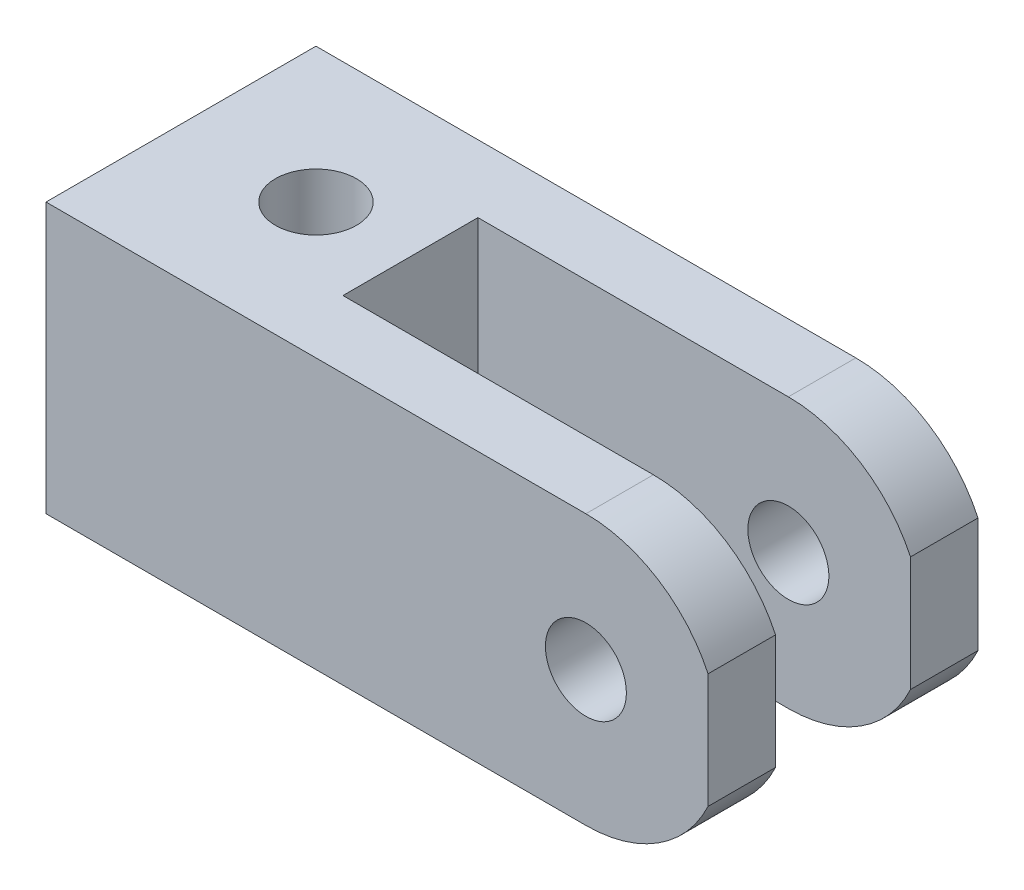
ISO-10303-21;
HEADER;
FILE_DESCRIPTION(('STEP AP214'),'2;1');
FILE_NAME('part.step','',(''),(''),'','','');
FILE_SCHEMA(('AUTOMOTIVE_DESIGN { 1 0 10303 214 1 1 1 1 }'));
ENDSEC;
DATA;
#1=APPLICATION_CONTEXT('core data for automotive mechanical design processes');
#2=APPLICATION_PROTOCOL_DEFINITION('international standard','automotive_design',2000,#1);
#3=PRODUCT_CONTEXT('',#1,'mechanical');
#4=PRODUCT('Part','Part','',(#3));
#5=PRODUCT_RELATED_PRODUCT_CATEGORY('part','',(#4));
#6=PRODUCT_DEFINITION_FORMATION('','',#4);
#7=PRODUCT_DEFINITION_CONTEXT('part definition',#1,'design');
#8=PRODUCT_DEFINITION('design','',#6,#7);
#9=PRODUCT_DEFINITION_SHAPE('','',#8);
#10=(LENGTH_UNIT() NAMED_UNIT(*) SI_UNIT(.MILLI.,.METRE.));
#11=(NAMED_UNIT(*) PLANE_ANGLE_UNIT() SI_UNIT($,.RADIAN.));
#12=(NAMED_UNIT(*) SI_UNIT($,.STERADIAN.) SOLID_ANGLE_UNIT());
#13=UNCERTAINTY_MEASURE_WITH_UNIT(LENGTH_MEASURE(1.E-05),#10,'distance_accuracy_value','');
#14=(GEOMETRIC_REPRESENTATION_CONTEXT(3) GLOBAL_UNCERTAINTY_ASSIGNED_CONTEXT((#13)) GLOBAL_UNIT_ASSIGNED_CONTEXT((#10,
#11,#12)) REPRESENTATION_CONTEXT('',''));
#15=CARTESIAN_POINT('',(0.,0.,0.));
#16=DIRECTION('',(0.,0.,1.));
#17=DIRECTION('',(1.,0.,0.));
#18=AXIS2_PLACEMENT_3D('',#15,#16,#17);
#19=CARTESIAN_POINT('',(5.,-5.,10.));
#20=DIRECTION('',(0.,1.,0.));
#21=DIRECTION('',(-1.,0.,0.));
#22=AXIS2_PLACEMENT_3D('',#19,#20,#21);
#23=PLANE('',#22);
#24=CARTESIAN_POINT('',(-15.,-5.,5.));
#25=DIRECTION('',(0.,1.,0.));
#26=DIRECTION('',(-1.,0.,0.));
#27=AXIS2_PLACEMENT_3D('',#24,#25,#26);
#28=CIRCLE('',#27,1.5);
#29=CARTESIAN_POINT('',(-16.5,-5.,5.));
#30=VERTEX_POINT('',#29);
#31=EDGE_CURVE('E195',#30,#30,#28,.T.);
#32=ORIENTED_EDGE('',*,*,#31,.T.);
#33=EDGE_LOOP('',(#32));
#34=FACE_BOUND('',#33,.T.);
#35=DIRECTION('',(0.,0.,1.));
#36=VECTOR('',#35,1.);
#37=CARTESIAN_POINT('',(0.,-5.,0.));
#38=LINE('',#37,#36);
#39=CARTESIAN_POINT('',(0.,-5.,7.5));
#40=VERTEX_POINT('',#39);
#41=CARTESIAN_POINT('',(0.,-5.,10.));
#42=VERTEX_POINT('',#41);
#43=EDGE_CURVE('E158',#40,#42,#38,.T.);
#44=ORIENTED_EDGE('',*,*,#43,.T.);
#45=DIRECTION('',(1.,0.,0.));
#46=VECTOR('',#45,1.);
#47=CARTESIAN_POINT('',(5.,-5.,10.));
#48=LINE('',#47,#46);
#49=CARTESIAN_POINT('',(-20.,-5.,10.));
#50=VERTEX_POINT('',#49);
#51=EDGE_CURVE('E209',#50,#42,#48,.T.);
#52=ORIENTED_EDGE('',*,*,#51,.F.);
#53=DIRECTION('',(0.,0.,-1.));
#54=VECTOR('',#53,1.);
#55=CARTESIAN_POINT('',(-20.,-5.,10.));
#56=LINE('',#55,#54);
#57=CARTESIAN_POINT('',(-20.,-5.,0.));
#58=VERTEX_POINT('',#57);
#59=EDGE_CURVE('E223',#50,#58,#56,.T.);
#60=ORIENTED_EDGE('',*,*,#59,.T.);
#61=DIRECTION('',(1.,0.,0.));
#62=VECTOR('',#61,1.);
#63=CARTESIAN_POINT('',(5.,-5.,0.));
#64=LINE('',#63,#62);
#65=CARTESIAN_POINT('',(0.,-5.,0.));
#66=VERTEX_POINT('',#65);
#67=EDGE_CURVE('E217',#58,#66,#64,.T.);
#68=ORIENTED_EDGE('',*,*,#67,.T.);
#69=CARTESIAN_POINT('',(0.,-5.,2.5));
#70=VERTEX_POINT('',#69);
#71=EDGE_CURVE('E155',#66,#70,#38,.T.);
#72=ORIENTED_EDGE('',*,*,#71,.T.);
#73=DIRECTION('',(1.,0.,0.));
#74=VECTOR('',#73,1.);
#75=CARTESIAN_POINT('',(-11.5,-5.,2.5));
#76=LINE('',#75,#74);
#77=CARTESIAN_POINT('',(-11.5,-5.,2.5));
#78=VERTEX_POINT('',#77);
#79=EDGE_CURVE('E187',#78,#70,#76,.T.);
#80=ORIENTED_EDGE('',*,*,#79,.F.);
#81=DIRECTION('',(0.,0.,-1.));
#82=VECTOR('',#81,1.);
#83=CARTESIAN_POINT('',(-11.5,-5.,7.5));
#84=LINE('',#83,#82);
#85=CARTESIAN_POINT('',(-11.5,-5.,7.5));
#86=VERTEX_POINT('',#85);
#87=EDGE_CURVE('E171',#86,#78,#84,.T.);
#88=ORIENTED_EDGE('',*,*,#87,.F.);
#89=DIRECTION('',(1.,0.,0.));
#90=VECTOR('',#89,1.);
#91=CARTESIAN_POINT('',(-11.5,-5.,7.5));
#92=LINE('',#91,#90);
#93=EDGE_CURVE('E179',#86,#40,#92,.T.);
#94=ORIENTED_EDGE('',*,*,#93,.T.);
#95=EDGE_LOOP('',(#44,#52,#60,#68,#72,#80,#88,#94));
#96=FACE_BOUND('',#95,.T.);
#97=ADVANCED_FACE('F32',(#34,#96),#23,.F.);
#98=CARTESIAN_POINT('',(0.,0.,10.));
#99=DIRECTION('',(0.,0.,-1.));
#100=DIRECTION('',(-1.,0.,0.));
#101=AXIS2_PLACEMENT_3D('',#98,#99,#100);
#102=CYLINDRICAL_SURFACE('',#101,1.5);
#103=CARTESIAN_POINT('',(0.,0.,7.5));
#104=DIRECTION('',(0.,0.,1.));
#105=DIRECTION('',(1.,0.,0.));
#106=AXIS2_PLACEMENT_3D('',#103,#104,#105);
#107=CIRCLE('',#106,1.5);
#108=CARTESIAN_POINT('',(1.5,0.,7.5));
#109=VERTEX_POINT('',#108);
#110=EDGE_CURVE('E196',#109,#109,#107,.T.);
#111=ORIENTED_EDGE('',*,*,#110,.F.);
#112=EDGE_LOOP('',(#111));
#113=FACE_BOUND('',#112,.T.);
#114=CARTESIAN_POINT('',(0.,0.,10.));
#115=DIRECTION('',(0.,0.,1.));
#116=DIRECTION('',(1.,0.,0.));
#117=AXIS2_PLACEMENT_3D('',#114,#115,#116);
#118=CIRCLE('',#117,1.5);
#119=CARTESIAN_POINT('',(1.5,0.,10.));
#120=VERTEX_POINT('',#119);
#121=EDGE_CURVE('E200',#120,#120,#118,.T.);
#122=ORIENTED_EDGE('',*,*,#121,.T.);
#123=EDGE_LOOP('',(#122));
#124=FACE_BOUND('',#123,.T.);
#125=ADVANCED_FACE('F278',(#113,#124),#102,.F.);
#126=CARTESIAN_POINT('',(0.,0.,10.));
#127=DIRECTION('',(0.,0.,1.));
#128=DIRECTION('',(1.,0.,0.));
#129=AXIS2_PLACEMENT_3D('',#126,#127,#128);
#130=PLANE('',#129);
#131=CARTESIAN_POINT('',(0.,0.,10.));
#132=DIRECTION('',(0.,0.,-1.));
#133=DIRECTION('',(1.,0.,0.));
#134=AXIS2_PLACEMENT_3D('',#131,#132,#133);
#135=CIRCLE('',#134,5.);
#136=CARTESIAN_POINT('',(0.,5.,10.));
#137=VERTEX_POINT('',#136);
#138=CARTESIAN_POINT('',(4.52508976466333,2.12686685566801,10.));
#139=VERTEX_POINT('',#138);
#140=EDGE_CURVE('E147',#137,#139,#135,.T.);
#141=ORIENTED_EDGE('',*,*,#140,.F.);
#142=DIRECTION('',(-1.,0.,0.));
#143=VECTOR('',#142,1.);
#144=CARTESIAN_POINT('',(5.,5.,10.));
#145=LINE('',#144,#143);
#146=CARTESIAN_POINT('',(-20.,5.,10.));
#147=VERTEX_POINT('',#146);
#148=EDGE_CURVE('E212',#137,#147,#145,.T.);
#149=ORIENTED_EDGE('',*,*,#148,.T.);
#150=DIRECTION('',(0.,-1.,0.));
#151=VECTOR('',#150,1.);
#152=CARTESIAN_POINT('',(-20.,-5.,10.));
#153=LINE('',#152,#151);
#154=EDGE_CURVE('E206',#147,#50,#153,.T.);
#155=ORIENTED_EDGE('',*,*,#154,.T.);
#156=ORIENTED_EDGE('',*,*,#51,.T.);
#157=CARTESIAN_POINT('',(0.,0.,10.));
#158=DIRECTION('',(0.,0.,-1.));
#159=DIRECTION('',(1.,0.,0.));
#160=AXIS2_PLACEMENT_3D('',#157,#158,#159);
#161=CIRCLE('',#160,5.);
#162=CARTESIAN_POINT('',(4.52508976466333,-2.12686685566801,10.));
#163=VERTEX_POINT('',#162);
#164=EDGE_CURVE('E141',#163,#42,#161,.T.);
#165=ORIENTED_EDGE('',*,*,#164,.F.);
#166=DIRECTION('',(0.,-1.,0.));
#167=VECTOR('',#166,1.);
#168=CARTESIAN_POINT('',(4.52508976466333,2.12686685566801,10.));
#169=LINE('',#168,#167);
#170=EDGE_CURVE('E143',#139,#163,#169,.T.);
#171=ORIENTED_EDGE('',*,*,#170,.F.);
#172=EDGE_LOOP('',(#141,#149,#155,#156,#165,#171));
#173=FACE_BOUND('',#172,.T.);
#174=ORIENTED_EDGE('',*,*,#121,.F.);
#175=EDGE_LOOP('',(#174));
#176=FACE_BOUND('',#175,.T.);
#177=ADVANCED_FACE('F263',(#173,#176),#130,.T.);
#178=CARTESIAN_POINT('',(0.,0.,0.));
#179=DIRECTION('',(0.,0.,1.));
#180=DIRECTION('',(1.,0.,0.));
#181=AXIS2_PLACEMENT_3D('',#178,#179,#180);
#182=PLANE('',#181);
#183=DIRECTION('',(-1.,0.,0.));
#184=VECTOR('',#183,1.);
#185=CARTESIAN_POINT('',(5.,5.,0.));
#186=LINE('',#185,#184);
#187=CARTESIAN_POINT('',(0.,5.,0.));
#188=VERTEX_POINT('',#187);
#189=CARTESIAN_POINT('',(-20.,5.,0.));
#190=VERTEX_POINT('',#189);
#191=EDGE_CURVE('E140',#188,#190,#186,.T.);
#192=ORIENTED_EDGE('',*,*,#191,.F.);
#193=CARTESIAN_POINT('',(0.,0.,0.));
#194=DIRECTION('',(0.,0.,-1.));
#195=DIRECTION('',(1.,0.,0.));
#196=AXIS2_PLACEMENT_3D('',#193,#194,#195);
#197=CIRCLE('',#196,5.);
#198=CARTESIAN_POINT('',(4.52508976466333,2.12686685566801,0.));
#199=VERTEX_POINT('',#198);
#200=EDGE_CURVE('E121',#188,#199,#197,.T.);
#201=ORIENTED_EDGE('',*,*,#200,.T.);
#202=DIRECTION('',(0.,-1.,0.));
#203=VECTOR('',#202,1.);
#204=CARTESIAN_POINT('',(4.52508976466333,2.12686685566801,0.));
#205=LINE('',#204,#203);
#206=CARTESIAN_POINT('',(4.52508976466333,-2.12686685566801,0.));
#207=VERTEX_POINT('',#206);
#208=EDGE_CURVE('E127',#199,#207,#205,.T.);
#209=ORIENTED_EDGE('',*,*,#208,.T.);
#210=CARTESIAN_POINT('',(0.,0.,0.));
#211=DIRECTION('',(0.,0.,-1.));
#212=DIRECTION('',(1.,0.,0.));
#213=AXIS2_PLACEMENT_3D('',#210,#211,#212);
#214=CIRCLE('',#213,5.);
#215=EDGE_CURVE('E134',#207,#66,#214,.T.);
#216=ORIENTED_EDGE('',*,*,#215,.T.);
#217=ORIENTED_EDGE('',*,*,#67,.F.);
#218=DIRECTION('',(0.,-1.,0.));
#219=VECTOR('',#218,1.);
#220=CARTESIAN_POINT('',(-20.,-5.,0.));
#221=LINE('',#220,#219);
#222=EDGE_CURVE('E203',#190,#58,#221,.T.);
#223=ORIENTED_EDGE('',*,*,#222,.F.);
#224=EDGE_LOOP('',(#192,#201,#209,#216,#217,#223));
#225=FACE_BOUND('',#224,.T.);
#226=CARTESIAN_POINT('',(0.,0.,0.));
#227=DIRECTION('',(0.,0.,1.));
#228=DIRECTION('',(1.,0.,0.));
#229=AXIS2_PLACEMENT_3D('',#226,#227,#228);
#230=CIRCLE('',#229,1.5);
#231=CARTESIAN_POINT('',(1.5,0.,0.));
#232=VERTEX_POINT('',#231);
#233=EDGE_CURVE('E199',#232,#232,#230,.T.);
#234=ORIENTED_EDGE('',*,*,#233,.T.);
#235=EDGE_LOOP('',(#234));
#236=FACE_BOUND('',#235,.T.);
#237=ADVANCED_FACE('F137',(#225,#236),#182,.F.);
#238=CARTESIAN_POINT('',(-20.,-5.,10.));
#239=DIRECTION('',(1.,0.,0.));
#240=DIRECTION('',(0.,0.,-1.));
#241=AXIS2_PLACEMENT_3D('',#238,#239,#240);
#242=PLANE('',#241);
#243=ORIENTED_EDGE('',*,*,#222,.T.);
#244=ORIENTED_EDGE('',*,*,#59,.F.);
#245=ORIENTED_EDGE('',*,*,#154,.F.);
#246=DIRECTION('',(0.,0.,-1.));
#247=VECTOR('',#246,1.);
#248=CARTESIAN_POINT('',(-20.,5.,10.));
#249=LINE('',#248,#247);
#250=EDGE_CURVE('E214',#147,#190,#249,.T.);
#251=ORIENTED_EDGE('',*,*,#250,.T.);
#252=EDGE_LOOP('',(#243,#244,#245,#251));
#253=FACE_BOUND('',#252,.T.);
#254=ADVANCED_FACE('F34',(#253),#242,.F.);
#255=CARTESIAN_POINT('',(5.,5.,10.));
#256=DIRECTION('',(0.,-1.,0.));
#257=DIRECTION('',(1.,0.,0.));
#258=AXIS2_PLACEMENT_3D('',#255,#256,#257);
#259=PLANE('',#258);
#260=ORIENTED_EDGE('',*,*,#148,.F.);
#261=DIRECTION('',(0.,0.,1.));
#262=VECTOR('',#261,1.);
#263=CARTESIAN_POINT('',(0.,5.,0.));
#264=LINE('',#263,#262);
#265=CARTESIAN_POINT('',(0.,5.,7.5));
#266=VERTEX_POINT('',#265);
#267=EDGE_CURVE('E154',#266,#137,#264,.T.);
#268=ORIENTED_EDGE('',*,*,#267,.F.);
#269=DIRECTION('',(1.,0.,0.));
#270=VECTOR('',#269,1.);
#271=CARTESIAN_POINT('',(-11.5,5.,7.5));
#272=LINE('',#271,#270);
#273=CARTESIAN_POINT('',(-11.5,5.,7.5));
#274=VERTEX_POINT('',#273);
#275=EDGE_CURVE('E180',#274,#266,#272,.T.);
#276=ORIENTED_EDGE('',*,*,#275,.F.);
#277=DIRECTION('',(0.,0.,1.));
#278=VECTOR('',#277,1.);
#279=CARTESIAN_POINT('',(-11.5,5.,7.5));
#280=LINE('',#279,#278);
#281=CARTESIAN_POINT('',(-11.5,5.,2.5));
#282=VERTEX_POINT('',#281);
#283=EDGE_CURVE('E176',#282,#274,#280,.T.);
#284=ORIENTED_EDGE('',*,*,#283,.F.);
#285=DIRECTION('',(1.,0.,0.));
#286=VECTOR('',#285,1.);
#287=CARTESIAN_POINT('',(-11.5,5.,2.5));
#288=LINE('',#287,#286);
#289=CARTESIAN_POINT('',(0.,5.,2.5));
#290=VERTEX_POINT('',#289);
#291=EDGE_CURVE('E184',#282,#290,#288,.T.);
#292=ORIENTED_EDGE('',*,*,#291,.T.);
#293=EDGE_CURVE('E151',#188,#290,#264,.T.);
#294=ORIENTED_EDGE('',*,*,#293,.F.);
#295=ORIENTED_EDGE('',*,*,#191,.T.);
#296=ORIENTED_EDGE('',*,*,#250,.F.);
#297=EDGE_LOOP('',(#260,#268,#276,#284,#292,#294,#295,#296));
#298=FACE_BOUND('',#297,.T.);
#299=CARTESIAN_POINT('',(-15.,5.,5.));
#300=DIRECTION('',(0.,1.,0.));
#301=DIRECTION('',(-1.,0.,0.));
#302=AXIS2_PLACEMENT_3D('',#299,#300,#301);
#303=CIRCLE('',#302,1.5);
#304=CARTESIAN_POINT('',(-16.5,5.,5.));
#305=VERTEX_POINT('',#304);
#306=EDGE_CURVE('E192',#305,#305,#303,.T.);
#307=ORIENTED_EDGE('',*,*,#306,.F.);
#308=EDGE_LOOP('',(#307));
#309=FACE_BOUND('',#308,.T.);
#310=ADVANCED_FACE('F246',(#298,#309),#259,.F.);
#311=CARTESIAN_POINT('',(0.,0.,2.5));
#312=DIRECTION('',(0.,0.,-1.));
#313=DIRECTION('',(-1.,0.,0.));
#314=AXIS2_PLACEMENT_3D('',#311,#312,#313);
#315=CIRCLE('',#314,1.5);
#316=CARTESIAN_POINT('',(-1.5,0.,2.5));
#317=VERTEX_POINT('',#316);
#318=EDGE_CURVE('E183',#317,#317,#315,.T.);
#319=ORIENTED_EDGE('',*,*,#318,.F.);
#320=EDGE_LOOP('',(#319));
#321=FACE_BOUND('',#320,.T.);
#322=ORIENTED_EDGE('',*,*,#233,.F.);
#323=EDGE_LOOP('',(#322));
#324=FACE_BOUND('',#323,.T.);
#325=ADVANCED_FACE('F285',(#321,#324),#102,.F.);
#326=CARTESIAN_POINT('',(-15.,-9.00000000000001,5.));
#327=DIRECTION('',(0.,1.,0.));
#328=DIRECTION('',(-1.,0.,0.));
#329=AXIS2_PLACEMENT_3D('',#326,#327,#328);
#330=CYLINDRICAL_SURFACE('',#329,1.5);
#331=ORIENTED_EDGE('',*,*,#306,.T.);
#332=EDGE_LOOP('',(#331));
#333=FACE_BOUND('',#332,.T.);
#334=ORIENTED_EDGE('',*,*,#31,.F.);
#335=EDGE_LOOP('',(#334));
#336=FACE_BOUND('',#335,.T.);
#337=ADVANCED_FACE('F294',(#333,#336),#330,.F.);
#338=CARTESIAN_POINT('',(-11.5,-5.,7.5));
#339=DIRECTION('',(0.,0.,1.));
#340=DIRECTION('',(1.,0.,0.));
#341=AXIS2_PLACEMENT_3D('',#338,#339,#340);
#342=PLANE('',#341);
#343=ORIENTED_EDGE('',*,*,#275,.T.);
#344=CARTESIAN_POINT('',(0.,0.,7.5));
#345=DIRECTION('',(0.,0.,1.));
#346=DIRECTION('',(1.,0.,0.));
#347=AXIS2_PLACEMENT_3D('',#344,#345,#346);
#348=CIRCLE('',#347,5.);
#349=CARTESIAN_POINT('',(4.52508976466333,2.12686685566801,7.5));
#350=VERTEX_POINT('',#349);
#351=EDGE_CURVE('E165',#266,#350,#348,.F.);
#352=ORIENTED_EDGE('',*,*,#351,.T.);
#353=DIRECTION('',(0.,-1.,0.));
#354=VECTOR('',#353,1.);
#355=CARTESIAN_POINT('',(4.52508976466333,-5.,7.5));
#356=LINE('',#355,#354);
#357=CARTESIAN_POINT('',(4.52508976466333,-2.12686685566801,7.5));
#358=VERTEX_POINT('',#357);
#359=EDGE_CURVE('E153',#350,#358,#356,.T.);
#360=ORIENTED_EDGE('',*,*,#359,.T.);
#361=CARTESIAN_POINT('',(0.,0.,7.5));
#362=DIRECTION('',(0.,0.,1.));
#363=DIRECTION('',(1.,0.,0.));
#364=AXIS2_PLACEMENT_3D('',#361,#362,#363);
#365=CIRCLE('',#364,5.);
#366=EDGE_CURVE('E162',#358,#40,#365,.F.);
#367=ORIENTED_EDGE('',*,*,#366,.T.);
#368=ORIENTED_EDGE('',*,*,#93,.F.);
#369=DIRECTION('',(0.,-1.,0.));
#370=VECTOR('',#369,1.);
#371=CARTESIAN_POINT('',(-11.5,-5.,7.5));
#372=LINE('',#371,#370);
#373=EDGE_CURVE('E168',#274,#86,#372,.T.);
#374=ORIENTED_EDGE('',*,*,#373,.F.);
#375=EDGE_LOOP('',(#343,#352,#360,#367,#368,#374));
#376=FACE_BOUND('',#375,.T.);
#377=ORIENTED_EDGE('',*,*,#110,.T.);
#378=EDGE_LOOP('',(#377));
#379=FACE_BOUND('',#378,.T.);
#380=ADVANCED_FACE('F255',(#376,#379),#342,.F.);
#381=CARTESIAN_POINT('',(-11.5,-5.,2.5));
#382=DIRECTION('',(0.,0.,-1.));
#383=DIRECTION('',(-1.,0.,0.));
#384=AXIS2_PLACEMENT_3D('',#381,#382,#383);
#385=PLANE('',#384);
#386=ORIENTED_EDGE('',*,*,#318,.T.);
#387=EDGE_LOOP('',(#386));
#388=FACE_BOUND('',#387,.T.);
#389=DIRECTION('',(0.,1.,0.));
#390=VECTOR('',#389,1.);
#391=CARTESIAN_POINT('',(4.52508976466333,-5.,2.5));
#392=LINE('',#391,#390);
#393=CARTESIAN_POINT('',(4.52508976466333,-2.12686685566801,2.5));
#394=VERTEX_POINT('',#393);
#395=CARTESIAN_POINT('',(4.52508976466333,2.12686685566801,2.5));
#396=VERTEX_POINT('',#395);
#397=EDGE_CURVE('E226',#394,#396,#392,.T.);
#398=ORIENTED_EDGE('',*,*,#397,.T.);
#399=CARTESIAN_POINT('',(0.,0.,2.5));
#400=DIRECTION('',(0.,0.,-1.));
#401=DIRECTION('',(-1.,0.,0.));
#402=AXIS2_PLACEMENT_3D('',#399,#400,#401);
#403=CIRCLE('',#402,5.);
#404=EDGE_CURVE('E11',#396,#290,#403,.F.);
#405=ORIENTED_EDGE('',*,*,#404,.T.);
#406=ORIENTED_EDGE('',*,*,#291,.F.);
#407=DIRECTION('',(0.,1.,0.));
#408=VECTOR('',#407,1.);
#409=CARTESIAN_POINT('',(-11.5,-5.,2.5));
#410=LINE('',#409,#408);
#411=EDGE_CURVE('E174',#78,#282,#410,.T.);
#412=ORIENTED_EDGE('',*,*,#411,.F.);
#413=ORIENTED_EDGE('',*,*,#79,.T.);
#414=CARTESIAN_POINT('',(0.,0.,2.5));
#415=DIRECTION('',(0.,0.,-1.));
#416=DIRECTION('',(-1.,0.,0.));
#417=AXIS2_PLACEMENT_3D('',#414,#415,#416);
#418=CIRCLE('',#417,5.);
#419=EDGE_CURVE('E40',#70,#394,#418,.F.);
#420=ORIENTED_EDGE('',*,*,#419,.T.);
#421=EDGE_LOOP('',(#398,#405,#406,#412,#413,#420));
#422=FACE_BOUND('',#421,.T.);
#423=ADVANCED_FACE('F233',(#388,#422),#385,.F.);
#424=CARTESIAN_POINT('',(-11.5,0.,0.));
#425=DIRECTION('',(-1.,0.,0.));
#426=DIRECTION('',(0.,0.,1.));
#427=AXIS2_PLACEMENT_3D('',#424,#425,#426);
#428=PLANE('',#427);
#429=ORIENTED_EDGE('',*,*,#373,.T.);
#430=ORIENTED_EDGE('',*,*,#87,.T.);
#431=ORIENTED_EDGE('',*,*,#411,.T.);
#432=ORIENTED_EDGE('',*,*,#283,.T.);
#433=EDGE_LOOP('',(#429,#430,#431,#432));
#434=FACE_BOUND('',#433,.T.);
#435=ADVANCED_FACE('F253',(#434),#428,.F.);
#436=CARTESIAN_POINT('',(4.52508976466333,2.12686685566801,0.));
#437=DIRECTION('',(-1.,0.,0.));
#438=DIRECTION('',(0.,0.,1.));
#439=AXIS2_PLACEMENT_3D('',#436,#437,#438);
#440=PLANE('',#439);
#441=DIRECTION('',(0.,0.,1.));
#442=VECTOR('',#441,1.);
#443=CARTESIAN_POINT('',(4.52508976466333,-2.12686685566801,0.));
#444=LINE('',#443,#442);
#445=EDGE_CURVE('E130',#207,#394,#444,.T.);
#446=ORIENTED_EDGE('',*,*,#445,.F.);
#447=ORIENTED_EDGE('',*,*,#208,.F.);
#448=DIRECTION('',(0.,0.,1.));
#449=VECTOR('',#448,1.);
#450=CARTESIAN_POINT('',(4.52508976466333,2.12686685566801,0.));
#451=LINE('',#450,#449);
#452=EDGE_CURVE('E55',#199,#396,#451,.T.);
#453=ORIENTED_EDGE('',*,*,#452,.T.);
#454=ORIENTED_EDGE('',*,*,#397,.F.);
#455=EDGE_LOOP('',(#446,#447,#453,#454));
#456=FACE_BOUND('',#455,.T.);
#457=ADVANCED_FACE('F128',(#456),#440,.F.);
#458=CARTESIAN_POINT('',(0.,0.,0.));
#459=DIRECTION('',(0.,0.,1.));
#460=DIRECTION('',(1.,0.,0.));
#461=AXIS2_PLACEMENT_3D('',#458,#459,#460);
#462=CYLINDRICAL_SURFACE('',#461,5.);
#463=ORIENTED_EDGE('',*,*,#71,.F.);
#464=ORIENTED_EDGE('',*,*,#215,.F.);
#465=ORIENTED_EDGE('',*,*,#445,.T.);
#466=ORIENTED_EDGE('',*,*,#419,.F.);
#467=EDGE_LOOP('',(#463,#464,#465,#466));
#468=FACE_BOUND('',#467,.T.);
#469=ADVANCED_FACE('F236',(#468),#462,.T.);
#470=CARTESIAN_POINT('',(0.,0.,0.));
#471=DIRECTION('',(0.,0.,1.));
#472=DIRECTION('',(1.,0.,0.));
#473=AXIS2_PLACEMENT_3D('',#470,#471,#472);
#474=CYLINDRICAL_SURFACE('',#473,5.);
#475=ORIENTED_EDGE('',*,*,#452,.F.);
#476=ORIENTED_EDGE('',*,*,#200,.F.);
#477=ORIENTED_EDGE('',*,*,#293,.T.);
#478=ORIENTED_EDGE('',*,*,#404,.F.);
#479=EDGE_LOOP('',(#475,#476,#477,#478));
#480=FACE_BOUND('',#479,.T.);
#481=ADVANCED_FACE('F119',(#480),#474,.T.);
#482=ORIENTED_EDGE('',*,*,#267,.T.);
#483=ORIENTED_EDGE('',*,*,#140,.T.);
#484=EDGE_CURVE('E124',#350,#139,#451,.T.);
#485=ORIENTED_EDGE('',*,*,#484,.F.);
#486=ORIENTED_EDGE('',*,*,#351,.F.);
#487=EDGE_LOOP('',(#482,#483,#485,#486));
#488=FACE_BOUND('',#487,.T.);
#489=ADVANCED_FACE('F267',(#488),#474,.T.);
#490=EDGE_CURVE('E47',#358,#163,#444,.T.);
#491=ORIENTED_EDGE('',*,*,#490,.T.);
#492=ORIENTED_EDGE('',*,*,#164,.T.);
#493=ORIENTED_EDGE('',*,*,#43,.F.);
#494=ORIENTED_EDGE('',*,*,#366,.F.);
#495=EDGE_LOOP('',(#491,#492,#493,#494));
#496=FACE_BOUND('',#495,.T.);
#497=ADVANCED_FACE('F258',(#496),#462,.T.);
#498=ORIENTED_EDGE('',*,*,#484,.T.);
#499=ORIENTED_EDGE('',*,*,#170,.T.);
#500=ORIENTED_EDGE('',*,*,#490,.F.);
#501=ORIENTED_EDGE('',*,*,#359,.F.);
#502=EDGE_LOOP('',(#498,#499,#500,#501));
#503=FACE_BOUND('',#502,.T.);
#504=ADVANCED_FACE('F268',(#503),#440,.F.);
#505=CLOSED_SHELL('',(#97,#125,#177,#237,#254,#310,#325,#337,#380,#423,#435,#457,#469,#481,#489,
#497,#504));
#506=MANIFOLD_SOLID_BREP('B2',#505);
#507=ADVANCED_BREP_SHAPE_REPRESENTATION('',(#18,#506),#14);
#508=SHAPE_DEFINITION_REPRESENTATION(#9,#507);
ENDSEC;
END-ISO-10303-21;
